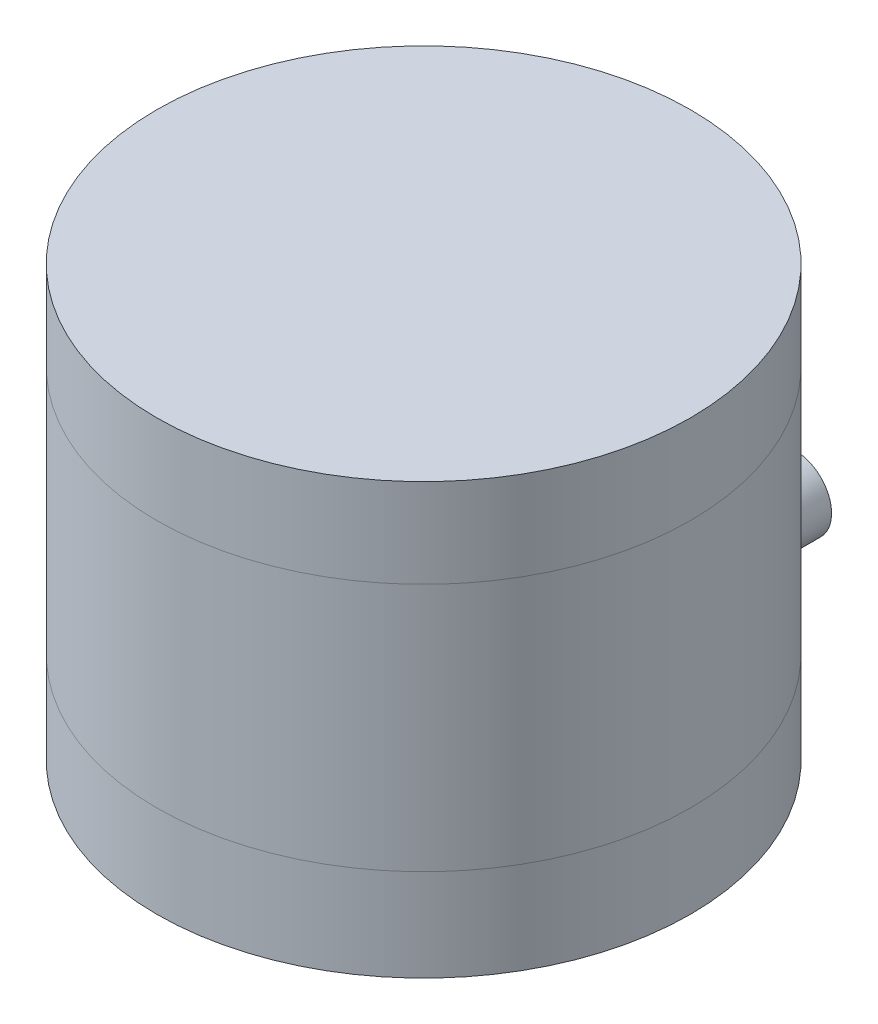
ISO-10303-21;
HEADER;
FILE_DESCRIPTION(('STEP AP214'),'2;1');
FILE_NAME('part.step','',(''),(''),'','','');
FILE_SCHEMA(('AUTOMOTIVE_DESIGN { 1 0 10303 214 1 1 1 1 }'));
ENDSEC;
DATA;
#1=APPLICATION_CONTEXT('core data for automotive mechanical design processes');
#2=APPLICATION_PROTOCOL_DEFINITION('international standard','automotive_design',2000,#1);
#3=PRODUCT_CONTEXT('',#1,'mechanical');
#4=PRODUCT('Part','Part','',(#3));
#5=PRODUCT_RELATED_PRODUCT_CATEGORY('part','',(#4));
#6=PRODUCT_DEFINITION_FORMATION('','',#4);
#7=PRODUCT_DEFINITION_CONTEXT('part definition',#1,'design');
#8=PRODUCT_DEFINITION('design','',#6,#7);
#9=PRODUCT_DEFINITION_SHAPE('','',#8);
#10=(LENGTH_UNIT() NAMED_UNIT(*) SI_UNIT(.MILLI.,.METRE.));
#11=(NAMED_UNIT(*) PLANE_ANGLE_UNIT() SI_UNIT($,.RADIAN.));
#12=(NAMED_UNIT(*) SI_UNIT($,.STERADIAN.) SOLID_ANGLE_UNIT());
#13=UNCERTAINTY_MEASURE_WITH_UNIT(LENGTH_MEASURE(1.E-05),#10,'distance_accuracy_value','');
#14=(GEOMETRIC_REPRESENTATION_CONTEXT(3) GLOBAL_UNCERTAINTY_ASSIGNED_CONTEXT((#13)) GLOBAL_UNIT_ASSIGNED_CONTEXT((#10,
#11,#12)) REPRESENTATION_CONTEXT('',''));
#15=CARTESIAN_POINT('',(0.,0.,0.));
#16=DIRECTION('',(0.,0.,1.));
#17=DIRECTION('',(1.,0.,0.));
#18=AXIS2_PLACEMENT_3D('',#15,#16,#17);
#19=CARTESIAN_POINT('',(-11.1189485930498,17.4,-49.1582036102329));
#20=CARTESIAN_POINT('',(-8.7922773975007,17.4,-50.4571073121492));
#21=CARTESIAN_POINT('',(-10.5733804156892,17.4,-52.7610949850017));
#22=CARTESIAN_POINT('',(-9.27696902859719,17.4,-54.4));
#23=B_SPLINE_CURVE_WITH_KNOTS('',3,(#19,#20,#21,#22),.UNSPECIFIED.,.F.,.F.,(4,4),(0.,1.),.UNSPECIFIED.);
#24=DIRECTION('',(0.,-1.,0.));
#25=VECTOR('',#24,1.);
#26=SURFACE_OF_LINEAR_EXTRUSION('',#23,#25);
#27=CARTESIAN_POINT('',(-11.1189485930498,0.,-49.1582036102329));
#28=CARTESIAN_POINT('',(-8.7922773975007,0.,-50.4571073121492));
#29=CARTESIAN_POINT('',(-10.5733804156892,0.,-52.7610949850017));
#30=CARTESIAN_POINT('',(-9.27696902859719,0.,-54.4));
#31=B_SPLINE_CURVE_WITH_KNOTS('',3,(#27,#28,#29,#30),.UNSPECIFIED.,.F.,.F.,(4,4),(0.,1.),.UNSPECIFIED.);
#32=CARTESIAN_POINT('',(-11.1189485930498,0.,-49.1582036102329));
#33=VERTEX_POINT('',#32);
#34=CARTESIAN_POINT('',(-9.27696902859719,0.,-54.4));
#35=VERTEX_POINT('',#34);
#36=EDGE_CURVE('E149',#33,#35,#31,.T.);
#37=ORIENTED_EDGE('',*,*,#36,.F.);
#38=DIRECTION('',(0.,-1.,0.));
#39=VECTOR('',#38,1.);
#40=CARTESIAN_POINT('',(-11.1189485930498,17.4,-49.1582036102329));
#41=LINE('',#40,#39);
#42=CARTESIAN_POINT('',(-11.1189485930498,17.4,-49.1582036102329));
#43=VERTEX_POINT('',#42);
#44=EDGE_CURVE('E59',#43,#33,#41,.T.);
#45=ORIENTED_EDGE('',*,*,#44,.F.);
#46=CARTESIAN_POINT('',(-9.27696902859719,17.4,-54.4));
#47=VERTEX_POINT('',#46);
#48=EDGE_CURVE('E157',#43,#47,#23,.T.);
#49=ORIENTED_EDGE('',*,*,#48,.T.);
#50=DIRECTION('',(0.,-1.,0.));
#51=VECTOR('',#50,1.);
#52=CARTESIAN_POINT('',(-9.27696902859719,17.4,-54.4));
#53=LINE('',#52,#51);
#54=EDGE_CURVE('E54',#47,#35,#53,.T.);
#55=ORIENTED_EDGE('',*,*,#54,.T.);
#56=EDGE_LOOP('',(#37,#45,#49,#55));
#57=FACE_BOUND('',#56,.T.);
#58=ADVANCED_FACE('F50',(#57),#26,.T.);
#59=CARTESIAN_POINT('',(-11.1189485930498,17.4,-49.1582036102329));
#60=DIRECTION('',(0.,0.,1.));
#61=DIRECTION('',(1.,0.,0.));
#62=AXIS2_PLACEMENT_3D('',#59,#60,#61);
#63=PLANE('',#62);
#64=DIRECTION('',(-1.,0.,0.));
#65=VECTOR('',#64,1.);
#66=CARTESIAN_POINT('',(-11.1189485930498,0.,-49.1582036102329));
#67=LINE('',#66,#65);
#68=CARTESIAN_POINT('',(11.1189485930498,0.,-49.1582036102329));
#69=VERTEX_POINT('',#68);
#70=EDGE_CURVE('E164',#69,#33,#67,.T.);
#71=ORIENTED_EDGE('',*,*,#70,.F.);
#72=DIRECTION('',(0.,-1.,0.));
#73=VECTOR('',#72,1.);
#74=CARTESIAN_POINT('',(11.1189485930498,17.4,-49.1582036102329));
#75=LINE('',#74,#73);
#76=CARTESIAN_POINT('',(11.1189485930498,17.4,-49.1582036102329));
#77=VERTEX_POINT('',#76);
#78=EDGE_CURVE('E220',#77,#69,#75,.T.);
#79=ORIENTED_EDGE('',*,*,#78,.F.);
#80=DIRECTION('',(-1.,0.,0.));
#81=VECTOR('',#80,1.);
#82=CARTESIAN_POINT('',(-11.1189485930498,17.4,-49.1582036102329));
#83=LINE('',#82,#81);
#84=EDGE_CURVE('E176',#77,#43,#83,.T.);
#85=ORIENTED_EDGE('',*,*,#84,.T.);
#86=ORIENTED_EDGE('',*,*,#44,.T.);
#87=EDGE_LOOP('',(#71,#79,#85,#86));
#88=FACE_BOUND('',#87,.T.);
#89=ADVANCED_FACE('F185',(#88),#63,.T.);
#90=CARTESIAN_POINT('',(9.27696902859721,17.4,-54.4));
#91=CARTESIAN_POINT('',(10.5733804156892,17.4,-52.7610949850016));
#92=CARTESIAN_POINT('',(8.79227739750073,17.4,-50.4571073121492));
#93=CARTESIAN_POINT('',(11.1189485930498,17.4,-49.1582036102329));
#94=B_SPLINE_CURVE_WITH_KNOTS('',3,(#90,#91,#92,#93),.UNSPECIFIED.,.F.,.F.,(4,4),(0.,1.),.UNSPECIFIED.);
#95=DIRECTION('',(0.,-1.,0.));
#96=VECTOR('',#95,1.);
#97=SURFACE_OF_LINEAR_EXTRUSION('',#94,#96);
#98=CARTESIAN_POINT('',(9.27696902859721,0.,-54.4));
#99=CARTESIAN_POINT('',(10.5733804156892,0.,-52.7610949850016));
#100=CARTESIAN_POINT('',(8.79227739750073,0.,-50.4571073121492));
#101=CARTESIAN_POINT('',(11.1189485930498,0.,-49.1582036102329));
#102=B_SPLINE_CURVE_WITH_KNOTS('',3,(#98,#99,#100,#101),.UNSPECIFIED.,.F.,.F.,(4,4),(0.,1.),.UNSPECIFIED.);
#103=CARTESIAN_POINT('',(9.27696902859721,0.,-54.4));
#104=VERTEX_POINT('',#103);
#105=EDGE_CURVE('E212',#104,#69,#102,.T.);
#106=ORIENTED_EDGE('',*,*,#105,.F.);
#107=DIRECTION('',(0.,-1.,0.));
#108=VECTOR('',#107,1.);
#109=CARTESIAN_POINT('',(9.27696902859721,17.4,-54.4));
#110=LINE('',#109,#108);
#111=CARTESIAN_POINT('',(9.27696902859721,17.4,-54.4));
#112=VERTEX_POINT('',#111);
#113=EDGE_CURVE('E221',#112,#104,#110,.T.);
#114=ORIENTED_EDGE('',*,*,#113,.F.);
#115=EDGE_CURVE('E170',#112,#77,#94,.T.);
#116=ORIENTED_EDGE('',*,*,#115,.T.);
#117=ORIENTED_EDGE('',*,*,#78,.T.);
#118=EDGE_LOOP('',(#106,#114,#116,#117));
#119=FACE_BOUND('',#118,.T.);
#120=ADVANCED_FACE('F181',(#119),#97,.T.);
#121=CARTESIAN_POINT('',(-9.27696902859719,17.4,-54.4));
#122=DIRECTION('',(0.,0.,-1.));
#123=DIRECTION('',(-1.,0.,0.));
#124=AXIS2_PLACEMENT_3D('',#121,#122,#123);
#125=PLANE('',#124);
#126=DIRECTION('',(0.866025403784439,0.5,0.));
#127=VECTOR('',#126,1.);
#128=CARTESIAN_POINT('',(-7.40439526827442,12.9749296013246,-54.4));
#129=LINE('',#128,#127);
#130=CARTESIAN_POINT('',(-7.40439526827442,12.9749296013246,-54.4));
#131=VERTEX_POINT('',#130);
#132=CARTESIAN_POINT('',(0.,17.2498592026493,-54.4));
#133=VERTEX_POINT('',#132);
#134=EDGE_CURVE('E67',#131,#133,#129,.T.);
#135=ORIENTED_EDGE('',*,*,#134,.F.);
#136=DIRECTION('',(0.,1.,0.));
#137=VECTOR('',#136,1.);
#138=CARTESIAN_POINT('',(-7.40439526827442,4.42507039867537,-54.4));
#139=LINE('',#138,#137);
#140=CARTESIAN_POINT('',(-7.40439526827442,4.42507039867537,-54.4));
#141=VERTEX_POINT('',#140);
#142=EDGE_CURVE('E71',#141,#131,#139,.T.);
#143=ORIENTED_EDGE('',*,*,#142,.F.);
#144=DIRECTION('',(-0.866025403784439,0.5,0.));
#145=VECTOR('',#144,1.);
#146=CARTESIAN_POINT('',(0.,0.150140797350742,-54.4));
#147=LINE('',#146,#145);
#148=CARTESIAN_POINT('',(0.,0.150140797350742,-54.4));
#149=VERTEX_POINT('',#148);
#150=EDGE_CURVE('E291',#149,#141,#147,.T.);
#151=ORIENTED_EDGE('',*,*,#150,.F.);
#152=DIRECTION('',(-0.866025403784439,-0.5,0.));
#153=VECTOR('',#152,1.);
#154=CARTESIAN_POINT('',(7.40439526827442,4.42507039867537,-54.4));
#155=LINE('',#154,#153);
#156=CARTESIAN_POINT('',(7.40439526827442,4.42507039867537,-54.4));
#157=VERTEX_POINT('',#156);
#158=EDGE_CURVE('E288',#157,#149,#155,.T.);
#159=ORIENTED_EDGE('',*,*,#158,.F.);
#160=DIRECTION('',(0.,-1.,0.));
#161=VECTOR('',#160,1.);
#162=CARTESIAN_POINT('',(7.40439526827442,12.9749296013246,-54.4));
#163=LINE('',#162,#161);
#164=CARTESIAN_POINT('',(7.40439526827442,12.9749296013246,-54.4));
#165=VERTEX_POINT('',#164);
#166=EDGE_CURVE('E285',#165,#157,#163,.T.);
#167=ORIENTED_EDGE('',*,*,#166,.F.);
#168=DIRECTION('',(0.866025403784439,-0.5,0.));
#169=VECTOR('',#168,1.);
#170=CARTESIAN_POINT('',(0.,17.2498592026493,-54.4));
#171=LINE('',#170,#169);
#172=EDGE_CURVE('E274',#133,#165,#171,.T.);
#173=ORIENTED_EDGE('',*,*,#172,.F.);
#174=EDGE_LOOP('',(#135,#143,#151,#159,#167,#173));
#175=FACE_BOUND('',#174,.T.);
#176=DIRECTION('',(1.,0.,0.));
#177=VECTOR('',#176,1.);
#178=CARTESIAN_POINT('',(-9.27696902859719,0.,-54.4));
#179=LINE('',#178,#177);
#180=EDGE_CURVE('E152',#35,#104,#179,.T.);
#181=ORIENTED_EDGE('',*,*,#180,.F.);
#182=ORIENTED_EDGE('',*,*,#54,.F.);
#183=DIRECTION('',(1.,0.,0.));
#184=VECTOR('',#183,1.);
#185=CARTESIAN_POINT('',(-9.27696902859719,17.4,-54.4));
#186=LINE('',#185,#184);
#187=EDGE_CURVE('E163',#47,#112,#186,.T.);
#188=ORIENTED_EDGE('',*,*,#187,.T.);
#189=ORIENTED_EDGE('',*,*,#113,.T.);
#190=EDGE_LOOP('',(#181,#182,#188,#189));
#191=FACE_BOUND('',#190,.T.);
#192=ADVANCED_FACE('F184',(#175,#191),#125,.T.);
#193=CARTESIAN_POINT('',(-9.81161138265209,17.4,-51.6516013127107));
#194=DIRECTION('',(0.,-1.,0.));
#195=DIRECTION('',(0.,0.,-1.));
#196=AXIS2_PLACEMENT_3D('',#193,#194,#195);
#197=PLANE('',#196);
#198=ORIENTED_EDGE('',*,*,#48,.F.);
#199=ORIENTED_EDGE('',*,*,#84,.F.);
#200=ORIENTED_EDGE('',*,*,#115,.F.);
#201=ORIENTED_EDGE('',*,*,#187,.F.);
#202=EDGE_LOOP('',(#198,#199,#200,#201));
#203=FACE_BOUND('',#202,.T.);
#204=ADVANCED_FACE('F189',(#203),#197,.F.);
#205=CARTESIAN_POINT('',(-9.81161138265209,0.,-51.6516013127107));
#206=DIRECTION('',(0.,-1.,0.));
#207=DIRECTION('',(0.,0.,-1.));
#208=AXIS2_PLACEMENT_3D('',#205,#206,#207);
#209=PLANE('',#208);
#210=ORIENTED_EDGE('',*,*,#36,.T.);
#211=ORIENTED_EDGE('',*,*,#180,.T.);
#212=ORIENTED_EDGE('',*,*,#105,.T.);
#213=ORIENTED_EDGE('',*,*,#70,.T.);
#214=EDGE_LOOP('',(#210,#211,#212,#213));
#215=FACE_BOUND('',#214,.T.);
#216=ADVANCED_FACE('F193',(#215),#209,.T.);
#217=CARTESIAN_POINT('',(-7.40439526827442,12.9749296013246,-56.8));
#218=DIRECTION('',(0.5,-0.866025403784439,0.));
#219=DIRECTION('',(0.866025403784439,0.5,0.));
#220=AXIS2_PLACEMENT_3D('',#217,#218,#219);
#221=PLANE('',#220);
#222=ORIENTED_EDGE('',*,*,#134,.T.);
#223=DIRECTION('',(0.,0.,1.));
#224=VECTOR('',#223,1.);
#225=CARTESIAN_POINT('',(0.,17.2498592026493,-56.8));
#226=LINE('',#225,#224);
#227=CARTESIAN_POINT('',(0.,17.2498592026493,-56.8));
#228=VERTEX_POINT('',#227);
#229=EDGE_CURVE('E132',#228,#133,#226,.T.);
#230=ORIENTED_EDGE('',*,*,#229,.F.);
#231=DIRECTION('',(0.866025403784439,0.5,0.));
#232=VECTOR('',#231,1.);
#233=CARTESIAN_POINT('',(-7.40439526827442,12.9749296013246,-56.8));
#234=LINE('',#233,#232);
#235=CARTESIAN_POINT('',(-7.40439526827442,12.9749296013246,-56.8));
#236=VERTEX_POINT('',#235);
#237=EDGE_CURVE('E138',#236,#228,#234,.T.);
#238=ORIENTED_EDGE('',*,*,#237,.F.);
#239=DIRECTION('',(0.,0.,1.));
#240=VECTOR('',#239,1.);
#241=CARTESIAN_POINT('',(-7.40439526827442,12.9749296013246,-56.8));
#242=LINE('',#241,#240);
#243=EDGE_CURVE('E282',#236,#131,#242,.T.);
#244=ORIENTED_EDGE('',*,*,#243,.T.);
#245=EDGE_LOOP('',(#222,#230,#238,#244));
#246=FACE_BOUND('',#245,.T.);
#247=ADVANCED_FACE('F148',(#246),#221,.F.);
#248=CARTESIAN_POINT('',(0.,17.2498592026493,-56.8));
#249=DIRECTION('',(-0.5,-0.866025403784439,0.));
#250=DIRECTION('',(0.866025403784439,-0.5,0.));
#251=AXIS2_PLACEMENT_3D('',#248,#249,#250);
#252=PLANE('',#251);
#253=ORIENTED_EDGE('',*,*,#172,.T.);
#254=DIRECTION('',(0.,0.,1.));
#255=VECTOR('',#254,1.);
#256=CARTESIAN_POINT('',(7.40439526827442,12.9749296013246,-56.8));
#257=LINE('',#256,#255);
#258=CARTESIAN_POINT('',(7.40439526827442,12.9749296013246,-56.8));
#259=VERTEX_POINT('',#258);
#260=EDGE_CURVE('E134',#259,#165,#257,.T.);
#261=ORIENTED_EDGE('',*,*,#260,.F.);
#262=DIRECTION('',(0.866025403784439,-0.5,0.));
#263=VECTOR('',#262,1.);
#264=CARTESIAN_POINT('',(0.,17.2498592026493,-56.8));
#265=LINE('',#264,#263);
#266=EDGE_CURVE('E127',#228,#259,#265,.T.);
#267=ORIENTED_EDGE('',*,*,#266,.F.);
#268=ORIENTED_EDGE('',*,*,#229,.T.);
#269=EDGE_LOOP('',(#253,#261,#267,#268));
#270=FACE_BOUND('',#269,.T.);
#271=ADVANCED_FACE('F130',(#270),#252,.F.);
#272=CARTESIAN_POINT('',(7.40439526827442,12.9749296013246,-56.8));
#273=DIRECTION('',(-1.,0.,0.));
#274=DIRECTION('',(0.,-1.,0.));
#275=AXIS2_PLACEMENT_3D('',#272,#273,#274);
#276=PLANE('',#275);
#277=ORIENTED_EDGE('',*,*,#166,.T.);
#278=DIRECTION('',(0.,0.,1.));
#279=VECTOR('',#278,1.);
#280=CARTESIAN_POINT('',(7.40439526827442,4.42507039867537,-56.8));
#281=LINE('',#280,#279);
#282=CARTESIAN_POINT('',(7.40439526827442,4.42507039867537,-56.8));
#283=VERTEX_POINT('',#282);
#284=EDGE_CURVE('E154',#283,#157,#281,.T.);
#285=ORIENTED_EDGE('',*,*,#284,.F.);
#286=DIRECTION('',(0.,-1.,0.));
#287=VECTOR('',#286,1.);
#288=CARTESIAN_POINT('',(7.40439526827442,12.9749296013246,-56.8));
#289=LINE('',#288,#287);
#290=EDGE_CURVE('E137',#259,#283,#289,.T.);
#291=ORIENTED_EDGE('',*,*,#290,.F.);
#292=ORIENTED_EDGE('',*,*,#260,.T.);
#293=EDGE_LOOP('',(#277,#285,#291,#292));
#294=FACE_BOUND('',#293,.T.);
#295=ADVANCED_FACE('F242',(#294),#276,.F.);
#296=CARTESIAN_POINT('',(7.40439526827442,4.42507039867537,-56.8));
#297=DIRECTION('',(-0.5,0.866025403784439,0.));
#298=DIRECTION('',(-0.866025403784439,-0.5,0.));
#299=AXIS2_PLACEMENT_3D('',#296,#297,#298);
#300=PLANE('',#299);
#301=ORIENTED_EDGE('',*,*,#158,.T.);
#302=DIRECTION('',(0.,0.,1.));
#303=VECTOR('',#302,1.);
#304=CARTESIAN_POINT('',(0.,0.150140797350742,-56.8));
#305=LINE('',#304,#303);
#306=CARTESIAN_POINT('',(0.,0.150140797350742,-56.8));
#307=VERTEX_POINT('',#306);
#308=EDGE_CURVE('E298',#307,#149,#305,.T.);
#309=ORIENTED_EDGE('',*,*,#308,.F.);
#310=DIRECTION('',(-0.866025403784439,-0.5,0.));
#311=VECTOR('',#310,1.);
#312=CARTESIAN_POINT('',(7.40439526827442,4.42507039867537,-56.8));
#313=LINE('',#312,#311);
#314=EDGE_CURVE('E278',#283,#307,#313,.T.);
#315=ORIENTED_EDGE('',*,*,#314,.F.);
#316=ORIENTED_EDGE('',*,*,#284,.T.);
#317=EDGE_LOOP('',(#301,#309,#315,#316));
#318=FACE_BOUND('',#317,.T.);
#319=ADVANCED_FACE('F245',(#318),#300,.F.);
#320=CARTESIAN_POINT('',(0.,0.150140797350742,-56.8));
#321=DIRECTION('',(0.5,0.866025403784439,0.));
#322=DIRECTION('',(-0.866025403784439,0.5,0.));
#323=AXIS2_PLACEMENT_3D('',#320,#321,#322);
#324=PLANE('',#323);
#325=ORIENTED_EDGE('',*,*,#150,.T.);
#326=DIRECTION('',(0.,0.,1.));
#327=VECTOR('',#326,1.);
#328=CARTESIAN_POINT('',(-7.40439526827442,4.42507039867537,-56.8));
#329=LINE('',#328,#327);
#330=CARTESIAN_POINT('',(-7.40439526827442,4.42507039867537,-56.8));
#331=VERTEX_POINT('',#330);
#332=EDGE_CURVE('E295',#331,#141,#329,.T.);
#333=ORIENTED_EDGE('',*,*,#332,.F.);
#334=DIRECTION('',(-0.866025403784439,0.5,0.));
#335=VECTOR('',#334,1.);
#336=CARTESIAN_POINT('',(0.,0.150140797350742,-56.8));
#337=LINE('',#336,#335);
#338=EDGE_CURVE('E280',#307,#331,#337,.T.);
#339=ORIENTED_EDGE('',*,*,#338,.F.);
#340=ORIENTED_EDGE('',*,*,#308,.T.);
#341=EDGE_LOOP('',(#325,#333,#339,#340));
#342=FACE_BOUND('',#341,.T.);
#343=ADVANCED_FACE('F249',(#342),#324,.F.);
#344=CARTESIAN_POINT('',(-7.40439526827442,4.42507039867537,-56.8));
#345=DIRECTION('',(1.,0.,0.));
#346=DIRECTION('',(0.,1.,0.));
#347=AXIS2_PLACEMENT_3D('',#344,#345,#346);
#348=PLANE('',#347);
#349=ORIENTED_EDGE('',*,*,#142,.T.);
#350=ORIENTED_EDGE('',*,*,#243,.F.);
#351=DIRECTION('',(0.,1.,0.));
#352=VECTOR('',#351,1.);
#353=CARTESIAN_POINT('',(-7.40439526827442,4.42507039867537,-56.8));
#354=LINE('',#353,#352);
#355=EDGE_CURVE('E143',#331,#236,#354,.T.);
#356=ORIENTED_EDGE('',*,*,#355,.F.);
#357=ORIENTED_EDGE('',*,*,#332,.T.);
#358=EDGE_LOOP('',(#349,#350,#356,#357));
#359=FACE_BOUND('',#358,.T.);
#360=ADVANCED_FACE('F253',(#359),#348,.F.);
#361=CARTESIAN_POINT('',(0.,0.,-56.8));
#362=DIRECTION('',(0.,0.,-1.));
#363=DIRECTION('',(-1.,0.,0.));
#364=AXIS2_PLACEMENT_3D('',#361,#362,#363);
#365=PLANE('',#364);
#366=CARTESIAN_POINT('',(0.,8.7,-56.8));
#367=DIRECTION('',(0.,0.,-1.));
#368=DIRECTION('',(-1.,0.,0.));
#369=AXIS2_PLACEMENT_3D('',#366,#367,#368);
#370=CIRCLE('',#369,6.84025605517852);
#371=CARTESIAN_POINT('',(-6.84025605517851,8.7,-56.8));
#372=VERTEX_POINT('',#371);
#373=EDGE_CURVE('E12',#372,#372,#370,.T.);
#374=ORIENTED_EDGE('',*,*,#373,.F.);
#375=EDGE_LOOP('',(#374));
#376=FACE_BOUND('',#375,.T.);
#377=ORIENTED_EDGE('',*,*,#237,.T.);
#378=ORIENTED_EDGE('',*,*,#266,.T.);
#379=ORIENTED_EDGE('',*,*,#290,.T.);
#380=ORIENTED_EDGE('',*,*,#314,.T.);
#381=ORIENTED_EDGE('',*,*,#338,.T.);
#382=ORIENTED_EDGE('',*,*,#355,.T.);
#383=EDGE_LOOP('',(#377,#378,#379,#380,#381,#382));
#384=FACE_BOUND('',#383,.T.);
#385=ADVANCED_FACE('F141',(#376,#384),#365,.T.);
#386=CARTESIAN_POINT('',(0.,8.7,-70.2));
#387=DIRECTION('',(0.,0.,1.));
#388=DIRECTION('',(1.,0.,0.));
#389=AXIS2_PLACEMENT_3D('',#386,#387,#388);
#390=CYLINDRICAL_SURFACE('',#389,6.84025605517852);
#391=CARTESIAN_POINT('',(0.,8.7,-70.2));
#392=DIRECTION('',(0.,0.,-1.));
#393=DIRECTION('',(-1.,0.,0.));
#394=AXIS2_PLACEMENT_3D('',#391,#392,#393);
#395=CIRCLE('',#394,6.84025605517852);
#396=CARTESIAN_POINT('',(-6.84025605517851,8.7,-70.2));
#397=VERTEX_POINT('',#396);
#398=EDGE_CURVE('E272',#397,#397,#395,.T.);
#399=ORIENTED_EDGE('',*,*,#398,.F.);
#400=EDGE_LOOP('',(#399));
#401=FACE_BOUND('',#400,.T.);
#402=ORIENTED_EDGE('',*,*,#373,.T.);
#403=EDGE_LOOP('',(#402));
#404=FACE_BOUND('',#403,.T.);
#405=ADVANCED_FACE('F260',(#401,#404),#390,.T.);
#406=CARTESIAN_POINT('',(0.,8.7,-70.2));
#407=DIRECTION('',(0.,0.,-1.));
#408=DIRECTION('',(-1.,0.,0.));
#409=AXIS2_PLACEMENT_3D('',#406,#407,#408);
#410=PLANE('',#409);
#411=ORIENTED_EDGE('',*,*,#398,.T.);
#412=EDGE_LOOP('',(#411));
#413=FACE_BOUND('',#412,.T.);
#414=ADVANCED_FACE('F264',(#413),#410,.T.);
#415=CLOSED_SHELL('',(#58,#89,#120,#192,#204,#216,#247,#271,#295,#319,#343,#360,#385,#405,#414));
#416=MANIFOLD_SOLID_BREP('B2',#415);
#417=CARTESIAN_POINT('',(0.,81.2,0.));
#418=DIRECTION('',(0.,-1.,0.));
#419=DIRECTION('',(0.,0.,-1.));
#420=AXIS2_PLACEMENT_3D('',#417,#418,#419);
#421=CYLINDRICAL_SURFACE('',#420,50.4);
#422=CARTESIAN_POINT('',(0.,81.2,0.));
#423=DIRECTION('',(0.,1.,0.));
#424=DIRECTION('',(0.,0.,1.));
#425=AXIS2_PLACEMENT_3D('',#422,#423,#424);
#426=CIRCLE('',#425,50.4);
#427=CARTESIAN_POINT('',(0.,81.2,50.4));
#428=VERTEX_POINT('',#427);
#429=EDGE_CURVE('E49',#428,#428,#426,.T.);
#430=ORIENTED_EDGE('',*,*,#429,.F.);
#431=EDGE_LOOP('',(#430));
#432=FACE_BOUND('',#431,.T.);
#433=CARTESIAN_POINT('',(0.,64.4,0.));
#434=DIRECTION('',(0.,1.,0.));
#435=DIRECTION('',(0.,0.,1.));
#436=AXIS2_PLACEMENT_3D('',#433,#434,#435);
#437=CIRCLE('',#436,50.4);
#438=CARTESIAN_POINT('',(0.,64.4,50.4));
#439=VERTEX_POINT('',#438);
#440=EDGE_CURVE('E405',#439,#439,#437,.T.);
#441=ORIENTED_EDGE('',*,*,#440,.T.);
#442=EDGE_LOOP('',(#441));
#443=FACE_BOUND('',#442,.T.);
#444=ADVANCED_FACE('F402',(#432,#443),#421,.T.);
#445=CARTESIAN_POINT('',(0.,81.2,0.));
#446=DIRECTION('',(0.,1.,0.));
#447=DIRECTION('',(0.,0.,1.));
#448=AXIS2_PLACEMENT_3D('',#445,#446,#447);
#449=PLANE('',#448);
#450=ORIENTED_EDGE('',*,*,#429,.T.);
#451=EDGE_LOOP('',(#450));
#452=FACE_BOUND('',#451,.T.);
#453=ADVANCED_FACE('F417',(#452),#449,.T.);
#454=CARTESIAN_POINT('',(0.,64.4,0.));
#455=DIRECTION('',(0.,1.,0.));
#456=DIRECTION('',(0.,0.,1.));
#457=AXIS2_PLACEMENT_3D('',#454,#455,#456);
#458=PLANE('',#457);
#459=ORIENTED_EDGE('',*,*,#440,.F.);
#460=EDGE_LOOP('',(#459));
#461=FACE_BOUND('',#460,.T.);
#462=ADVANCED_FACE('F415',(#461),#458,.F.);
#463=CLOSED_SHELL('',(#444,#453,#462));
#464=MANIFOLD_SOLID_BREP('B6',#463);
#465=CARTESIAN_POINT('',(0.,64.4,0.));
#466=DIRECTION('',(0.,-1.,0.));
#467=DIRECTION('',(0.,0.,-1.));
#468=AXIS2_PLACEMENT_3D('',#465,#466,#467);
#469=CYLINDRICAL_SURFACE('',#468,50.4);
#470=CARTESIAN_POINT('',(0.,64.4,0.));
#471=DIRECTION('',(0.,1.,0.));
#472=DIRECTION('',(0.,0.,1.));
#473=AXIS2_PLACEMENT_3D('',#470,#471,#472);
#474=CIRCLE('',#473,50.4);
#475=CARTESIAN_POINT('',(0.,64.4,50.4));
#476=VERTEX_POINT('',#475);
#477=EDGE_CURVE('E401',#476,#476,#474,.T.);
#478=ORIENTED_EDGE('',*,*,#477,.F.);
#479=EDGE_LOOP('',(#478));
#480=FACE_BOUND('',#479,.T.);
#481=CARTESIAN_POINT('',(0.,17.4,0.));
#482=DIRECTION('',(0.,1.,0.));
#483=DIRECTION('',(0.,0.,1.));
#484=AXIS2_PLACEMENT_3D('',#481,#482,#483);
#485=CIRCLE('',#484,50.4);
#486=CARTESIAN_POINT('',(0.,17.4,50.4));
#487=VERTEX_POINT('',#486);
#488=EDGE_CURVE('E456',#487,#487,#485,.T.);
#489=ORIENTED_EDGE('',*,*,#488,.T.);
#490=EDGE_LOOP('',(#489));
#491=FACE_BOUND('',#490,.T.);
#492=ADVANCED_FACE('F453',(#480,#491),#469,.T.);
#493=CARTESIAN_POINT('',(0.,64.4,0.));
#494=DIRECTION('',(0.,1.,0.));
#495=DIRECTION('',(0.,0.,1.));
#496=AXIS2_PLACEMENT_3D('',#493,#494,#495);
#497=PLANE('',#496);
#498=ORIENTED_EDGE('',*,*,#477,.T.);
#499=EDGE_LOOP('',(#498));
#500=FACE_BOUND('',#499,.T.);
#501=ADVANCED_FACE('F470',(#500),#497,.T.);
#502=CARTESIAN_POINT('',(0.,17.4,0.));
#503=DIRECTION('',(0.,1.,0.));
#504=DIRECTION('',(0.,0.,1.));
#505=AXIS2_PLACEMENT_3D('',#502,#503,#504);
#506=PLANE('',#505);
#507=ORIENTED_EDGE('',*,*,#488,.F.);
#508=EDGE_LOOP('',(#507));
#509=FACE_BOUND('',#508,.T.);
#510=ADVANCED_FACE('F468',(#509),#506,.F.);
#511=CLOSED_SHELL('',(#492,#501,#510));
#512=MANIFOLD_SOLID_BREP('B44',#511);
#513=CARTESIAN_POINT('',(0.,17.4,0.));
#514=DIRECTION('',(0.,-1.,0.));
#515=DIRECTION('',(0.,0.,-1.));
#516=AXIS2_PLACEMENT_3D('',#513,#514,#515);
#517=CYLINDRICAL_SURFACE('',#516,50.4);
#518=CARTESIAN_POINT('',(0.,17.4,0.));
#519=DIRECTION('',(0.,1.,0.));
#520=DIRECTION('',(0.,0.,1.));
#521=AXIS2_PLACEMENT_3D('',#518,#519,#520);
#522=CIRCLE('',#521,50.4);
#523=CARTESIAN_POINT('',(0.,17.4,50.4));
#524=VERTEX_POINT('',#523);
#525=EDGE_CURVE('E452',#524,#524,#522,.T.);
#526=ORIENTED_EDGE('',*,*,#525,.F.);
#527=EDGE_LOOP('',(#526));
#528=FACE_BOUND('',#527,.T.);
#529=CARTESIAN_POINT('',(0.,0.,0.));
#530=DIRECTION('',(0.,1.,0.));
#531=DIRECTION('',(0.,0.,1.));
#532=AXIS2_PLACEMENT_3D('',#529,#530,#531);
#533=CIRCLE('',#532,50.4);
#534=CARTESIAN_POINT('',(0.,0.,50.4));
#535=VERTEX_POINT('',#534);
#536=EDGE_CURVE('E500',#535,#535,#533,.T.);
#537=ORIENTED_EDGE('',*,*,#536,.T.);
#538=EDGE_LOOP('',(#537));
#539=FACE_BOUND('',#538,.T.);
#540=ADVANCED_FACE('F497',(#528,#539),#517,.T.);
#541=CARTESIAN_POINT('',(0.,17.4,0.));
#542=DIRECTION('',(0.,1.,0.));
#543=DIRECTION('',(0.,0.,1.));
#544=AXIS2_PLACEMENT_3D('',#541,#542,#543);
#545=PLANE('',#544);
#546=ORIENTED_EDGE('',*,*,#525,.T.);
#547=EDGE_LOOP('',(#546));
#548=FACE_BOUND('',#547,.T.);
#549=ADVANCED_FACE('F512',(#548),#545,.T.);
#550=CARTESIAN_POINT('',(0.,0.,0.));
#551=DIRECTION('',(0.,1.,0.));
#552=DIRECTION('',(0.,0.,1.));
#553=AXIS2_PLACEMENT_3D('',#550,#551,#552);
#554=PLANE('',#553);
#555=ORIENTED_EDGE('',*,*,#536,.F.);
#556=EDGE_LOOP('',(#555));
#557=FACE_BOUND('',#556,.T.);
#558=ADVANCED_FACE('F510',(#557),#554,.F.);
#559=CLOSED_SHELL('',(#540,#549,#558));
#560=MANIFOLD_SOLID_BREP('B396',#559);
#561=ADVANCED_BREP_SHAPE_REPRESENTATION('',(#18,#416,#464,#512,#560),#14);
#562=SHAPE_DEFINITION_REPRESENTATION(#9,#561);
ENDSEC;
END-ISO-10303-21;
